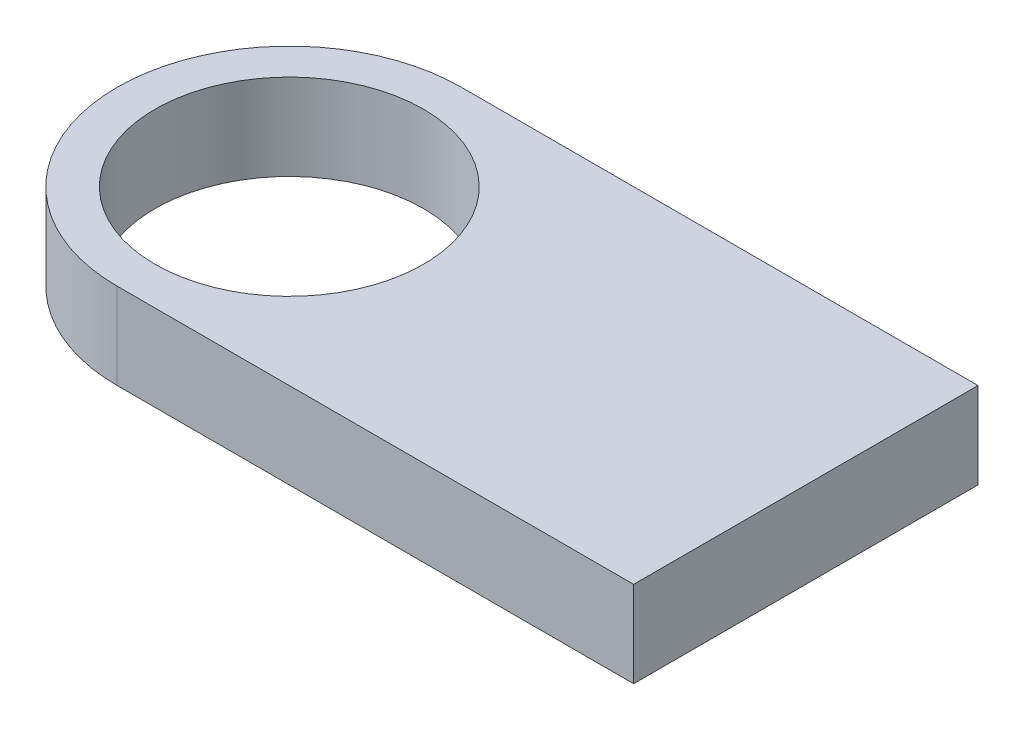
ISO-10303-21;
HEADER;
FILE_DESCRIPTION(('STEP AP214'),'2;1');
FILE_NAME('part.step','',(''),(''),'','','');
FILE_SCHEMA(('AUTOMOTIVE_DESIGN { 1 0 10303 214 1 1 1 1 }'));
ENDSEC;
DATA;
#1=APPLICATION_CONTEXT('core data for automotive mechanical design processes');
#2=APPLICATION_PROTOCOL_DEFINITION('international standard','automotive_design',2000,#1);
#3=PRODUCT_CONTEXT('',#1,'mechanical');
#4=PRODUCT('Part','Part','',(#3));
#5=PRODUCT_RELATED_PRODUCT_CATEGORY('part','',(#4));
#6=PRODUCT_DEFINITION_FORMATION('','',#4);
#7=PRODUCT_DEFINITION_CONTEXT('part definition',#1,'design');
#8=PRODUCT_DEFINITION('design','',#6,#7);
#9=PRODUCT_DEFINITION_SHAPE('','',#8);
#10=(LENGTH_UNIT() NAMED_UNIT(*) SI_UNIT(.MILLI.,.METRE.));
#11=(NAMED_UNIT(*) PLANE_ANGLE_UNIT() SI_UNIT($,.RADIAN.));
#12=(NAMED_UNIT(*) SI_UNIT($,.STERADIAN.) SOLID_ANGLE_UNIT());
#13=UNCERTAINTY_MEASURE_WITH_UNIT(LENGTH_MEASURE(1.E-05),#10,'distance_accuracy_value','');
#14=(GEOMETRIC_REPRESENTATION_CONTEXT(3) GLOBAL_UNCERTAINTY_ASSIGNED_CONTEXT((#13)) GLOBAL_UNIT_ASSIGNED_CONTEXT((#10,
#11,#12)) REPRESENTATION_CONTEXT('',''));
#15=CARTESIAN_POINT('',(0.,0.,0.));
#16=DIRECTION('',(0.,0.,1.));
#17=DIRECTION('',(1.,0.,0.));
#18=AXIS2_PLACEMENT_3D('',#15,#16,#17);
#19=CARTESIAN_POINT('',(0.,5.,-10.));
#20=DIRECTION('',(0.,0.,-1.));
#21=DIRECTION('',(-1.,0.,0.));
#22=AXIS2_PLACEMENT_3D('',#19,#20,#21);
#23=PLANE('',#22);
#24=DIRECTION('',(1.,0.,0.));
#25=VECTOR('',#24,1.);
#26=CARTESIAN_POINT('',(0.,0.,-10.));
#27=LINE('',#26,#25);
#28=CARTESIAN_POINT('',(0.,0.,-10.));
#29=VERTEX_POINT('',#28);
#30=CARTESIAN_POINT('',(30.,0.,-10.));
#31=VERTEX_POINT('',#30);
#32=EDGE_CURVE('E111',#29,#31,#27,.T.);
#33=ORIENTED_EDGE('',*,*,#32,.F.);
#34=DIRECTION('',(0.,-1.,0.));
#35=VECTOR('',#34,1.);
#36=CARTESIAN_POINT('',(0.,5.,-10.));
#37=LINE('',#36,#35);
#38=CARTESIAN_POINT('',(0.,5.,-10.));
#39=VERTEX_POINT('',#38);
#40=EDGE_CURVE('E11',#39,#29,#37,.T.);
#41=ORIENTED_EDGE('',*,*,#40,.F.);
#42=DIRECTION('',(1.,0.,0.));
#43=VECTOR('',#42,1.);
#44=CARTESIAN_POINT('',(0.,5.,-10.));
#45=LINE('',#44,#43);
#46=CARTESIAN_POINT('',(30.,5.,-10.));
#47=VERTEX_POINT('',#46);
#48=EDGE_CURVE('E103',#39,#47,#45,.T.);
#49=ORIENTED_EDGE('',*,*,#48,.T.);
#50=DIRECTION('',(0.,-1.,0.));
#51=VECTOR('',#50,1.);
#52=CARTESIAN_POINT('',(30.,5.,-10.));
#53=LINE('',#52,#51);
#54=EDGE_CURVE('E42',#47,#31,#53,.T.);
#55=ORIENTED_EDGE('',*,*,#54,.T.);
#56=EDGE_LOOP('',(#33,#41,#49,#55));
#57=FACE_BOUND('',#56,.T.);
#58=ADVANCED_FACE('F39',(#57),#23,.T.);
#59=CARTESIAN_POINT('',(0.,5.,0.));
#60=DIRECTION('',(0.,-1.,0.));
#61=DIRECTION('',(0.,0.,-1.));
#62=AXIS2_PLACEMENT_3D('',#59,#60,#61);
#63=CYLINDRICAL_SURFACE('',#62,10.);
#64=CARTESIAN_POINT('',(0.,0.,0.));
#65=DIRECTION('',(0.,1.,0.));
#66=DIRECTION('',(0.,0.,1.));
#67=AXIS2_PLACEMENT_3D('',#64,#65,#66);
#68=CIRCLE('',#67,10.);
#69=CARTESIAN_POINT('',(0.,0.,10.));
#70=VERTEX_POINT('',#69);
#71=EDGE_CURVE('E73',#29,#70,#68,.T.);
#72=ORIENTED_EDGE('',*,*,#71,.T.);
#73=DIRECTION('',(0.,-1.,0.));
#74=VECTOR('',#73,1.);
#75=CARTESIAN_POINT('',(0.,5.,10.));
#76=LINE('',#75,#74);
#77=CARTESIAN_POINT('',(0.,5.,10.));
#78=VERTEX_POINT('',#77);
#79=EDGE_CURVE('E49',#78,#70,#76,.T.);
#80=ORIENTED_EDGE('',*,*,#79,.F.);
#81=CARTESIAN_POINT('',(0.,5.,0.));
#82=DIRECTION('',(0.,1.,0.));
#83=DIRECTION('',(0.,0.,1.));
#84=AXIS2_PLACEMENT_3D('',#81,#82,#83);
#85=CIRCLE('',#84,10.);
#86=EDGE_CURVE('E88',#39,#78,#85,.T.);
#87=ORIENTED_EDGE('',*,*,#86,.F.);
#88=ORIENTED_EDGE('',*,*,#40,.T.);
#89=EDGE_LOOP('',(#72,#80,#87,#88));
#90=FACE_BOUND('',#89,.T.);
#91=ADVANCED_FACE('F128',(#90),#63,.T.);
#92=CARTESIAN_POINT('',(0.,5.,10.));
#93=DIRECTION('',(0.,0.,-1.));
#94=DIRECTION('',(-1.,0.,0.));
#95=AXIS2_PLACEMENT_3D('',#92,#93,#94);
#96=PLANE('',#95);
#97=DIRECTION('',(1.,0.,0.));
#98=VECTOR('',#97,1.);
#99=CARTESIAN_POINT('',(0.,0.,10.));
#100=LINE('',#99,#98);
#101=CARTESIAN_POINT('',(30.,0.,10.));
#102=VERTEX_POINT('',#101);
#103=EDGE_CURVE('E96',#70,#102,#100,.T.);
#104=ORIENTED_EDGE('',*,*,#103,.T.);
#105=DIRECTION('',(0.,-1.,0.));
#106=VECTOR('',#105,1.);
#107=CARTESIAN_POINT('',(30.,5.,10.));
#108=LINE('',#107,#106);
#109=CARTESIAN_POINT('',(30.,5.,10.));
#110=VERTEX_POINT('',#109);
#111=EDGE_CURVE('E93',#110,#102,#108,.T.);
#112=ORIENTED_EDGE('',*,*,#111,.F.);
#113=DIRECTION('',(1.,0.,0.));
#114=VECTOR('',#113,1.);
#115=CARTESIAN_POINT('',(0.,5.,10.));
#116=LINE('',#115,#114);
#117=EDGE_CURVE('E85',#78,#110,#116,.T.);
#118=ORIENTED_EDGE('',*,*,#117,.F.);
#119=ORIENTED_EDGE('',*,*,#79,.T.);
#120=EDGE_LOOP('',(#104,#112,#118,#119));
#121=FACE_BOUND('',#120,.T.);
#122=ADVANCED_FACE('F94',(#121),#96,.F.);
#123=CARTESIAN_POINT('',(30.,5.,10.));
#124=DIRECTION('',(-1.,0.,0.));
#125=DIRECTION('',(0.,0.,1.));
#126=AXIS2_PLACEMENT_3D('',#123,#124,#125);
#127=PLANE('',#126);
#128=DIRECTION('',(0.,0.,-1.));
#129=VECTOR('',#128,1.);
#130=CARTESIAN_POINT('',(30.,0.,10.));
#131=LINE('',#130,#129);
#132=EDGE_CURVE('E115',#102,#31,#131,.T.);
#133=ORIENTED_EDGE('',*,*,#132,.T.);
#134=ORIENTED_EDGE('',*,*,#54,.F.);
#135=DIRECTION('',(0.,0.,-1.));
#136=VECTOR('',#135,1.);
#137=CARTESIAN_POINT('',(30.,5.,10.));
#138=LINE('',#137,#136);
#139=EDGE_CURVE('E82',#110,#47,#138,.T.);
#140=ORIENTED_EDGE('',*,*,#139,.F.);
#141=ORIENTED_EDGE('',*,*,#111,.T.);
#142=EDGE_LOOP('',(#133,#134,#140,#141));
#143=FACE_BOUND('',#142,.T.);
#144=ADVANCED_FACE('F101',(#143),#127,.F.);
#145=CARTESIAN_POINT('',(0.,5.,0.));
#146=DIRECTION('',(0.,1.,0.));
#147=DIRECTION('',(0.,0.,1.));
#148=AXIS2_PLACEMENT_3D('',#145,#146,#147);
#149=PLANE('',#148);
#150=CARTESIAN_POINT('',(0.,5.,0.));
#151=DIRECTION('',(0.,1.,0.));
#152=DIRECTION('',(0.,0.,1.));
#153=AXIS2_PLACEMENT_3D('',#150,#151,#152);
#154=CIRCLE('',#153,7.8);
#155=CARTESIAN_POINT('',(0.,5.,7.8));
#156=VERTEX_POINT('',#155);
#157=EDGE_CURVE('E159',#156,#156,#154,.T.);
#158=ORIENTED_EDGE('',*,*,#157,.F.);
#159=EDGE_LOOP('',(#158));
#160=FACE_BOUND('',#159,.T.);
#161=ORIENTED_EDGE('',*,*,#48,.F.);
#162=ORIENTED_EDGE('',*,*,#86,.T.);
#163=ORIENTED_EDGE('',*,*,#117,.T.);
#164=ORIENTED_EDGE('',*,*,#139,.T.);
#165=EDGE_LOOP('',(#161,#162,#163,#164));
#166=FACE_BOUND('',#165,.T.);
#167=ADVANCED_FACE('F87',(#160,#166),#149,.T.);
#168=CARTESIAN_POINT('',(0.,0.,0.));
#169=DIRECTION('',(0.,1.,0.));
#170=DIRECTION('',(0.,0.,1.));
#171=AXIS2_PLACEMENT_3D('',#168,#169,#170);
#172=PLANE('',#171);
#173=CARTESIAN_POINT('',(0.,0.,0.));
#174=DIRECTION('',(0.,1.,0.));
#175=DIRECTION('',(0.,0.,1.));
#176=AXIS2_PLACEMENT_3D('',#173,#174,#175);
#177=CIRCLE('',#176,7.8);
#178=CARTESIAN_POINT('',(0.,0.,7.8));
#179=VERTEX_POINT('',#178);
#180=EDGE_CURVE('E116',#179,#179,#177,.T.);
#181=ORIENTED_EDGE('',*,*,#180,.T.);
#182=EDGE_LOOP('',(#181));
#183=FACE_BOUND('',#182,.T.);
#184=ORIENTED_EDGE('',*,*,#32,.T.);
#185=ORIENTED_EDGE('',*,*,#132,.F.);
#186=ORIENTED_EDGE('',*,*,#103,.F.);
#187=ORIENTED_EDGE('',*,*,#71,.F.);
#188=EDGE_LOOP('',(#184,#185,#186,#187));
#189=FACE_BOUND('',#188,.T.);
#190=ADVANCED_FACE('F125',(#183,#189),#172,.F.);
#191=CARTESIAN_POINT('',(0.,0.,0.));
#192=DIRECTION('',(0.,1.,0.));
#193=DIRECTION('',(0.,0.,1.));
#194=AXIS2_PLACEMENT_3D('',#191,#192,#193);
#195=CYLINDRICAL_SURFACE('',#194,7.8);
#196=ORIENTED_EDGE('',*,*,#180,.F.);
#197=EDGE_LOOP('',(#196));
#198=FACE_BOUND('',#197,.T.);
#199=ORIENTED_EDGE('',*,*,#157,.T.);
#200=EDGE_LOOP('',(#199));
#201=FACE_BOUND('',#200,.T.);
#202=ADVANCED_FACE('F147',(#198,#201),#195,.F.);
#203=CLOSED_SHELL('',(#58,#91,#122,#144,#167,#190,#202));
#204=MANIFOLD_SOLID_BREP('B2',#203);
#205=ADVANCED_BREP_SHAPE_REPRESENTATION('',(#18,#204),#14);
#206=SHAPE_DEFINITION_REPRESENTATION(#9,#205);
ENDSEC;
END-ISO-10303-21;
